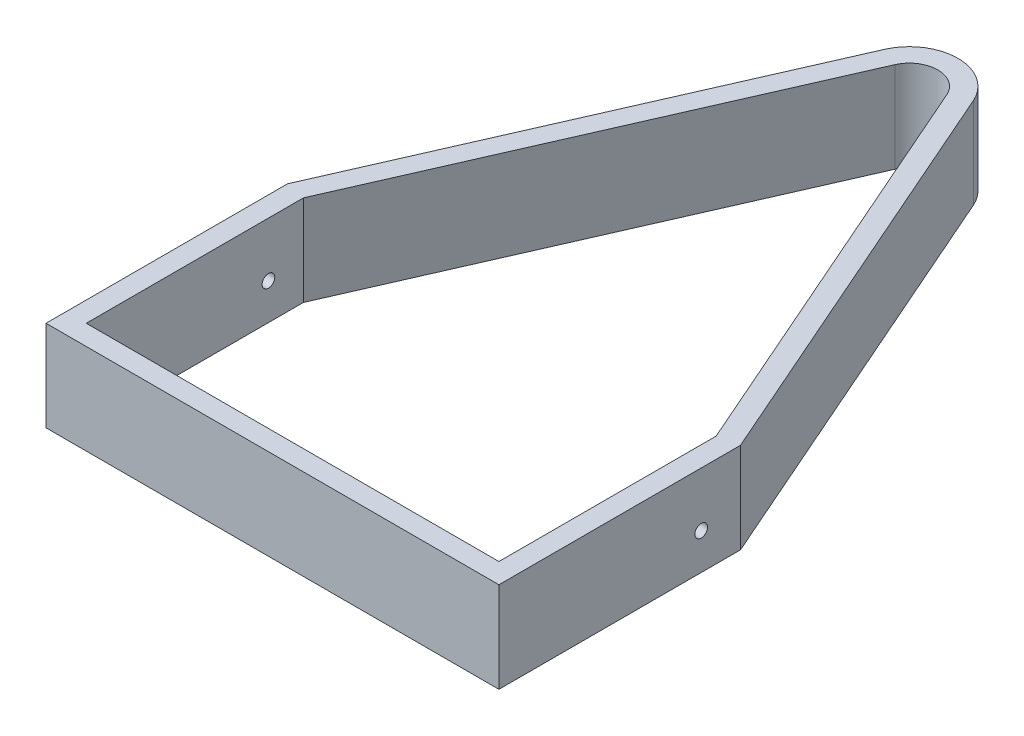
ISO-10303-21;
HEADER;
FILE_DESCRIPTION(('STEP AP214'),'2;1');
FILE_NAME('part.step','',(''),(''),'','','');
FILE_SCHEMA(('AUTOMOTIVE_DESIGN { 1 0 10303 214 1 1 1 1 }'));
ENDSEC;
DATA;
#1=APPLICATION_CONTEXT('core data for automotive mechanical design processes');
#2=APPLICATION_PROTOCOL_DEFINITION('international standard','automotive_design',2000,#1);
#3=PRODUCT_CONTEXT('',#1,'mechanical');
#4=PRODUCT('Part','Part','',(#3));
#5=PRODUCT_RELATED_PRODUCT_CATEGORY('part','',(#4));
#6=PRODUCT_DEFINITION_FORMATION('','',#4);
#7=PRODUCT_DEFINITION_CONTEXT('part definition',#1,'design');
#8=PRODUCT_DEFINITION('design','',#6,#7);
#9=PRODUCT_DEFINITION_SHAPE('','',#8);
#10=(LENGTH_UNIT() NAMED_UNIT(*) SI_UNIT(.MILLI.,.METRE.));
#11=(NAMED_UNIT(*) PLANE_ANGLE_UNIT() SI_UNIT($,.RADIAN.));
#12=(NAMED_UNIT(*) SI_UNIT($,.STERADIAN.) SOLID_ANGLE_UNIT());
#13=UNCERTAINTY_MEASURE_WITH_UNIT(LENGTH_MEASURE(1.E-05),#10,'distance_accuracy_value','');
#14=(GEOMETRIC_REPRESENTATION_CONTEXT(3) GLOBAL_UNCERTAINTY_ASSIGNED_CONTEXT((#13)) GLOBAL_UNIT_ASSIGNED_CONTEXT((#10,
#11,#12)) REPRESENTATION_CONTEXT('',''));
#15=CARTESIAN_POINT('',(0.,0.,0.));
#16=DIRECTION('',(0.,0.,1.));
#17=DIRECTION('',(1.,0.,0.));
#18=AXIS2_PLACEMENT_3D('',#15,#16,#17);
#19=CARTESIAN_POINT('',(0.,28.575,-200.91745481904));
#20=DIRECTION('',(0.,-1.,0.));
#21=DIRECTION('',(0.,0.,-1.));
#22=AXIS2_PLACEMENT_3D('',#19,#20,#21);
#23=PLANE('',#22);
#24=DIRECTION('',(0.,0.,-1.));
#25=VECTOR('',#24,1.);
#26=CARTESIAN_POINT('',(71.4375,28.575,0.));
#27=LINE('',#26,#25);
#28=CARTESIAN_POINT('',(71.4375,28.575,0.));
#29=VERTEX_POINT('',#28);
#30=CARTESIAN_POINT('',(71.4375,28.575,-76.2));
#31=VERTEX_POINT('',#30);
#32=EDGE_CURVE('E177',#29,#31,#27,.T.);
#33=ORIENTED_EDGE('',*,*,#32,.T.);
#34=DIRECTION('',(-0.401785714285714,0.,-0.915733716642517));
#35=VECTOR('',#34,1.);
#36=CARTESIAN_POINT('',(14.0180844391392,28.575,-207.068004882815));
#37=LINE('',#36,#35);
#38=CARTESIAN_POINT('',(14.0180844391392,28.575,-207.068004882815));
#39=VERTEX_POINT('',#38);
#40=EDGE_CURVE('E180',#31,#39,#37,.T.);
#41=ORIENTED_EDGE('',*,*,#40,.T.);
#42=CARTESIAN_POINT('',(0.,28.575,-200.91745481904));
#43=DIRECTION('',(0.,1.,0.));
#44=DIRECTION('',(0.,0.,-1.));
#45=AXIS2_PLACEMENT_3D('',#42,#43,#44);
#46=CIRCLE('',#45,15.3080357142857);
#47=CARTESIAN_POINT('',(-14.0180844391393,28.575,-207.068004882815));
#48=VERTEX_POINT('',#47);
#49=EDGE_CURVE('E183',#39,#48,#46,.T.);
#50=ORIENTED_EDGE('',*,*,#49,.T.);
#51=DIRECTION('',(-0.401785714285714,0.,0.915733716642518));
#52=VECTOR('',#51,1.);
#53=CARTESIAN_POINT('',(-71.4375,28.575,-76.2));
#54=LINE('',#53,#52);
#55=CARTESIAN_POINT('',(-71.4375,28.575,-76.2));
#56=VERTEX_POINT('',#55);
#57=EDGE_CURVE('E185',#48,#56,#54,.T.);
#58=ORIENTED_EDGE('',*,*,#57,.T.);
#59=DIRECTION('',(0.,0.,1.));
#60=VECTOR('',#59,1.);
#61=CARTESIAN_POINT('',(-71.4375,28.575,0.));
#62=LINE('',#61,#60);
#63=CARTESIAN_POINT('',(-71.4375,28.575,0.));
#64=VERTEX_POINT('',#63);
#65=EDGE_CURVE('E187',#56,#64,#62,.T.);
#66=ORIENTED_EDGE('',*,*,#65,.T.);
#67=DIRECTION('',(1.,0.,0.));
#68=VECTOR('',#67,1.);
#69=CARTESIAN_POINT('',(-71.4375,28.575,0.));
#70=LINE('',#69,#68);
#71=EDGE_CURVE('E189',#64,#29,#70,.T.);
#72=ORIENTED_EDGE('',*,*,#71,.T.);
#73=EDGE_LOOP('',(#33,#41,#50,#58,#66,#72));
#74=FACE_BOUND('',#73,.T.);
#75=DIRECTION('',(1.,0.,0.));
#76=VECTOR('',#75,1.);
#77=CARTESIAN_POINT('',(-65.0875,28.575,-6.35));
#78=LINE('',#77,#76);
#79=CARTESIAN_POINT('',(-65.0875,28.575,-6.35));
#80=VERTEX_POINT('',#79);
#81=CARTESIAN_POINT('',(65.0875,28.575,-6.35));
#82=VERTEX_POINT('',#81);
#83=EDGE_CURVE('E124',#80,#82,#78,.T.);
#84=ORIENTED_EDGE('',*,*,#83,.F.);
#85=DIRECTION('',(0.,0.,1.));
#86=VECTOR('',#85,1.);
#87=CARTESIAN_POINT('',(-65.0875,28.575,-6.35));
#88=LINE('',#87,#86);
#89=CARTESIAN_POINT('',(-65.0875,28.575,-74.8682182061368));
#90=VERTEX_POINT('',#89);
#91=EDGE_CURVE('E154',#90,#80,#88,.T.);
#92=ORIENTED_EDGE('',*,*,#91,.F.);
#93=DIRECTION('',(-0.401785714285714,0.,0.915733716642517));
#94=VECTOR('',#93,1.);
#95=CARTESIAN_POINT('',(-65.0875,28.575,-74.8682182061368));
#96=LINE('',#95,#94);
#97=CARTESIAN_POINT('',(-8.20317533845931,28.575,-204.516665597101));
#98=VERTEX_POINT('',#97);
#99=EDGE_CURVE('E152',#98,#90,#96,.T.);
#100=ORIENTED_EDGE('',*,*,#99,.F.);
#101=CARTESIAN_POINT('',(0.,28.575,-200.91745481904));
#102=DIRECTION('',(0.,1.,0.));
#103=DIRECTION('',(0.,0.,-1.));
#104=AXIS2_PLACEMENT_3D('',#101,#102,#103);
#105=CIRCLE('',#104,8.95803571428572);
#106=CARTESIAN_POINT('',(8.20317533845923,28.575,-204.516665597101));
#107=VERTEX_POINT('',#106);
#108=EDGE_CURVE('E147',#107,#98,#105,.T.);
#109=ORIENTED_EDGE('',*,*,#108,.F.);
#110=DIRECTION('',(-0.401785714285714,0.,-0.915733716642517));
#111=VECTOR('',#110,1.);
#112=CARTESIAN_POINT('',(8.20317533845923,28.575,-204.516665597101));
#113=LINE('',#112,#111);
#114=CARTESIAN_POINT('',(65.0875,28.575,-74.8682182061368));
#115=VERTEX_POINT('',#114);
#116=EDGE_CURVE('E145',#115,#107,#113,.T.);
#117=ORIENTED_EDGE('',*,*,#116,.F.);
#118=DIRECTION('',(0.,0.,-1.));
#119=VECTOR('',#118,1.);
#120=CARTESIAN_POINT('',(65.0875,28.575,-6.35));
#121=LINE('',#120,#119);
#122=EDGE_CURVE('E132',#82,#115,#121,.T.);
#123=ORIENTED_EDGE('',*,*,#122,.F.);
#124=EDGE_LOOP('',(#84,#92,#100,#109,#117,#123));
#125=FACE_BOUND('',#124,.T.);
#126=ADVANCED_FACE('F35',(#74,#125),#23,.F.);
#127=CARTESIAN_POINT('',(0.,0.,-200.91745481904));
#128=DIRECTION('',(0.,-1.,0.));
#129=DIRECTION('',(0.,0.,-1.));
#130=AXIS2_PLACEMENT_3D('',#127,#128,#129);
#131=PLANE('',#130);
#132=DIRECTION('',(0.,0.,-1.));
#133=VECTOR('',#132,1.);
#134=CARTESIAN_POINT('',(71.4375,0.,0.));
#135=LINE('',#134,#133);
#136=CARTESIAN_POINT('',(71.4375,0.,0.));
#137=VERTEX_POINT('',#136);
#138=CARTESIAN_POINT('',(71.4375,0.,-76.2));
#139=VERTEX_POINT('',#138);
#140=EDGE_CURVE('E140',#137,#139,#135,.T.);
#141=ORIENTED_EDGE('',*,*,#140,.F.);
#142=DIRECTION('',(1.,0.,0.));
#143=VECTOR('',#142,1.);
#144=CARTESIAN_POINT('',(-71.4375,0.,0.));
#145=LINE('',#144,#143);
#146=CARTESIAN_POINT('',(-71.4375,0.,0.));
#147=VERTEX_POINT('',#146);
#148=EDGE_CURVE('E181',#147,#137,#145,.T.);
#149=ORIENTED_EDGE('',*,*,#148,.F.);
#150=DIRECTION('',(0.,0.,1.));
#151=VECTOR('',#150,1.);
#152=CARTESIAN_POINT('',(-71.4375,0.,0.));
#153=LINE('',#152,#151);
#154=CARTESIAN_POINT('',(-71.4375,0.,-76.2));
#155=VERTEX_POINT('',#154);
#156=EDGE_CURVE('E200',#155,#147,#153,.T.);
#157=ORIENTED_EDGE('',*,*,#156,.F.);
#158=DIRECTION('',(-0.401785714285714,0.,0.915733716642518));
#159=VECTOR('',#158,1.);
#160=CARTESIAN_POINT('',(-71.4375,0.,-76.2));
#161=LINE('',#160,#159);
#162=CARTESIAN_POINT('',(-14.0180844391393,0.,-207.068004882815));
#163=VERTEX_POINT('',#162);
#164=EDGE_CURVE('E198',#163,#155,#161,.T.);
#165=ORIENTED_EDGE('',*,*,#164,.F.);
#166=CARTESIAN_POINT('',(0.,0.,-200.91745481904));
#167=DIRECTION('',(0.,1.,0.));
#168=DIRECTION('',(0.,0.,-1.));
#169=AXIS2_PLACEMENT_3D('',#166,#167,#168);
#170=CIRCLE('',#169,15.3080357142857);
#171=CARTESIAN_POINT('',(14.0180844391392,0.,-207.068004882815));
#172=VERTEX_POINT('',#171);
#173=EDGE_CURVE('E196',#172,#163,#170,.T.);
#174=ORIENTED_EDGE('',*,*,#173,.F.);
#175=DIRECTION('',(-0.401785714285714,0.,-0.915733716642517));
#176=VECTOR('',#175,1.);
#177=CARTESIAN_POINT('',(14.0180844391392,0.,-207.068004882815));
#178=LINE('',#177,#176);
#179=EDGE_CURVE('E194',#139,#172,#178,.T.);
#180=ORIENTED_EDGE('',*,*,#179,.F.);
#181=EDGE_LOOP('',(#141,#149,#157,#165,#174,#180));
#182=FACE_BOUND('',#181,.T.);
#183=DIRECTION('',(0.,0.,1.));
#184=VECTOR('',#183,1.);
#185=CARTESIAN_POINT('',(-65.0875,0.,-6.35));
#186=LINE('',#185,#184);
#187=CARTESIAN_POINT('',(-65.0875,0.,-74.8682182061368));
#188=VERTEX_POINT('',#187);
#189=CARTESIAN_POINT('',(-65.0875,0.,-6.34999999999999));
#190=VERTEX_POINT('',#189);
#191=EDGE_CURVE('E133',#188,#190,#186,.T.);
#192=ORIENTED_EDGE('',*,*,#191,.T.);
#193=DIRECTION('',(1.,0.,0.));
#194=VECTOR('',#193,1.);
#195=CARTESIAN_POINT('',(-65.0875,0.,-6.35));
#196=LINE('',#195,#194);
#197=CARTESIAN_POINT('',(65.0875,0.,-6.35));
#198=VERTEX_POINT('',#197);
#199=EDGE_CURVE('E58',#190,#198,#196,.T.);
#200=ORIENTED_EDGE('',*,*,#199,.T.);
#201=DIRECTION('',(0.,0.,-1.));
#202=VECTOR('',#201,1.);
#203=CARTESIAN_POINT('',(65.0875,0.,-6.35));
#204=LINE('',#203,#202);
#205=CARTESIAN_POINT('',(65.0875,0.,-74.8682182061368));
#206=VERTEX_POINT('',#205);
#207=EDGE_CURVE('E139',#198,#206,#204,.T.);
#208=ORIENTED_EDGE('',*,*,#207,.T.);
#209=DIRECTION('',(-0.401785714285714,0.,-0.915733716642517));
#210=VECTOR('',#209,1.);
#211=CARTESIAN_POINT('',(8.20317533845923,0.,-204.516665597101));
#212=LINE('',#211,#210);
#213=CARTESIAN_POINT('',(8.20317533845923,0.,-204.516665597101));
#214=VERTEX_POINT('',#213);
#215=EDGE_CURVE('E159',#206,#214,#212,.T.);
#216=ORIENTED_EDGE('',*,*,#215,.T.);
#217=CARTESIAN_POINT('',(0.,0.,-200.91745481904));
#218=DIRECTION('',(0.,1.,0.));
#219=DIRECTION('',(0.,0.,-1.));
#220=AXIS2_PLACEMENT_3D('',#217,#218,#219);
#221=CIRCLE('',#220,8.95803571428572);
#222=CARTESIAN_POINT('',(-8.20317533845931,0.,-204.516665597101));
#223=VERTEX_POINT('',#222);
#224=EDGE_CURVE('E162',#214,#223,#221,.T.);
#225=ORIENTED_EDGE('',*,*,#224,.T.);
#226=DIRECTION('',(-0.401785714285714,0.,0.915733716642517));
#227=VECTOR('',#226,1.);
#228=CARTESIAN_POINT('',(-65.0875,0.,-74.8682182061368));
#229=LINE('',#228,#227);
#230=EDGE_CURVE('E165',#223,#188,#229,.T.);
#231=ORIENTED_EDGE('',*,*,#230,.T.);
#232=EDGE_LOOP('',(#192,#200,#208,#216,#225,#231));
#233=FACE_BOUND('',#232,.T.);
#234=ADVANCED_FACE('F224',(#182,#233),#131,.T.);
#235=CARTESIAN_POINT('',(71.4375,28.575,0.));
#236=DIRECTION('',(-1.,0.,0.));
#237=DIRECTION('',(0.,0.,1.));
#238=AXIS2_PLACEMENT_3D('',#235,#236,#237);
#239=PLANE('',#238);
#240=CARTESIAN_POINT('',(71.4375,11.43,-63.8192182061368));
#241=DIRECTION('',(-1.,0.,0.));
#242=DIRECTION('',(0.,0.,1.));
#243=AXIS2_PLACEMENT_3D('',#240,#241,#242);
#244=CIRCLE('',#243,2.);
#245=CARTESIAN_POINT('',(71.4375,11.43,-61.8192182061368));
#246=VERTEX_POINT('',#245);
#247=EDGE_CURVE('E295',#246,#246,#244,.F.);
#248=ORIENTED_EDGE('',*,*,#247,.F.);
#249=EDGE_LOOP('',(#248));
#250=FACE_BOUND('',#249,.T.);
#251=ORIENTED_EDGE('',*,*,#140,.T.);
#252=DIRECTION('',(0.,-1.,0.));
#253=VECTOR('',#252,1.);
#254=CARTESIAN_POINT('',(71.4375,28.575,-76.2));
#255=LINE('',#254,#253);
#256=EDGE_CURVE('E11',#31,#139,#255,.T.);
#257=ORIENTED_EDGE('',*,*,#256,.F.);
#258=ORIENTED_EDGE('',*,*,#32,.F.);
#259=DIRECTION('',(0.,-1.,0.));
#260=VECTOR('',#259,1.);
#261=CARTESIAN_POINT('',(71.4375,28.575,0.));
#262=LINE('',#261,#260);
#263=EDGE_CURVE('E191',#29,#137,#262,.T.);
#264=ORIENTED_EDGE('',*,*,#263,.T.);
#265=EDGE_LOOP('',(#251,#257,#258,#264));
#266=FACE_BOUND('',#265,.T.);
#267=ADVANCED_FACE('F37',(#250,#266),#239,.F.);
#268=CARTESIAN_POINT('',(14.0180844391392,28.575,-207.068004882815));
#269=DIRECTION('',(-0.915733716642517,0.,0.401785714285714));
#270=DIRECTION('',(0.401785714285714,0.,0.915733716642517));
#271=AXIS2_PLACEMENT_3D('',#268,#269,#270);
#272=PLANE('',#271);
#273=ORIENTED_EDGE('',*,*,#179,.T.);
#274=DIRECTION('',(0.,-1.,0.));
#275=VECTOR('',#274,1.);
#276=CARTESIAN_POINT('',(14.0180844391392,28.575,-207.068004882815));
#277=LINE('',#276,#275);
#278=EDGE_CURVE('E43',#39,#172,#277,.T.);
#279=ORIENTED_EDGE('',*,*,#278,.F.);
#280=ORIENTED_EDGE('',*,*,#40,.F.);
#281=ORIENTED_EDGE('',*,*,#256,.T.);
#282=EDGE_LOOP('',(#273,#279,#280,#281));
#283=FACE_BOUND('',#282,.T.);
#284=ADVANCED_FACE('F241',(#283),#272,.F.);
#285=CARTESIAN_POINT('',(0.,28.575,-200.91745481904));
#286=DIRECTION('',(0.,-1.,0.));
#287=DIRECTION('',(0.,0.,-1.));
#288=AXIS2_PLACEMENT_3D('',#285,#286,#287);
#289=CYLINDRICAL_SURFACE('',#288,15.3080357142857);
#290=ORIENTED_EDGE('',*,*,#173,.T.);
#291=DIRECTION('',(0.,-1.,0.));
#292=VECTOR('',#291,1.);
#293=CARTESIAN_POINT('',(-14.0180844391393,28.575,-207.068004882815));
#294=LINE('',#293,#292);
#295=EDGE_CURVE('E211',#48,#163,#294,.T.);
#296=ORIENTED_EDGE('',*,*,#295,.F.);
#297=ORIENTED_EDGE('',*,*,#49,.F.);
#298=ORIENTED_EDGE('',*,*,#278,.T.);
#299=EDGE_LOOP('',(#290,#296,#297,#298));
#300=FACE_BOUND('',#299,.T.);
#301=ADVANCED_FACE('F218',(#300),#289,.T.);
#302=CARTESIAN_POINT('',(-71.4375,28.575,-76.2));
#303=DIRECTION('',(0.915733716642517,0.,0.401785714285714));
#304=DIRECTION('',(0.401785714285714,0.,-0.915733716642518));
#305=AXIS2_PLACEMENT_3D('',#302,#303,#304);
#306=PLANE('',#305);
#307=ORIENTED_EDGE('',*,*,#164,.T.);
#308=DIRECTION('',(0.,-1.,0.));
#309=VECTOR('',#308,1.);
#310=CARTESIAN_POINT('',(-71.4375,28.575,-76.2));
#311=LINE('',#310,#309);
#312=EDGE_CURVE('E208',#56,#155,#311,.T.);
#313=ORIENTED_EDGE('',*,*,#312,.F.);
#314=ORIENTED_EDGE('',*,*,#57,.F.);
#315=ORIENTED_EDGE('',*,*,#295,.T.);
#316=EDGE_LOOP('',(#307,#313,#314,#315));
#317=FACE_BOUND('',#316,.T.);
#318=ADVANCED_FACE('F230',(#317),#306,.F.);
#319=CARTESIAN_POINT('',(-71.4375,28.575,0.));
#320=DIRECTION('',(1.,0.,0.));
#321=DIRECTION('',(0.,0.,-1.));
#322=AXIS2_PLACEMENT_3D('',#319,#320,#321);
#323=PLANE('',#322);
#324=CARTESIAN_POINT('',(-71.4375,11.43,-63.8192182061368));
#325=DIRECTION('',(1.,0.,0.));
#326=DIRECTION('',(0.,0.,-1.));
#327=AXIS2_PLACEMENT_3D('',#324,#325,#326);
#328=CIRCLE('',#327,2.);
#329=CARTESIAN_POINT('',(-71.4375,11.43,-65.8192182061368));
#330=VERTEX_POINT('',#329);
#331=EDGE_CURVE('E157',#330,#330,#328,.F.);
#332=ORIENTED_EDGE('',*,*,#331,.F.);
#333=EDGE_LOOP('',(#332));
#334=FACE_BOUND('',#333,.T.);
#335=ORIENTED_EDGE('',*,*,#156,.T.);
#336=DIRECTION('',(0.,-1.,0.));
#337=VECTOR('',#336,1.);
#338=CARTESIAN_POINT('',(-71.4375,28.575,0.));
#339=LINE('',#338,#337);
#340=EDGE_CURVE('E205',#64,#147,#339,.T.);
#341=ORIENTED_EDGE('',*,*,#340,.F.);
#342=ORIENTED_EDGE('',*,*,#65,.F.);
#343=ORIENTED_EDGE('',*,*,#312,.T.);
#344=EDGE_LOOP('',(#335,#341,#342,#343));
#345=FACE_BOUND('',#344,.T.);
#346=ADVANCED_FACE('F234',(#334,#345),#323,.F.);
#347=CARTESIAN_POINT('',(-71.4375,28.575,0.));
#348=DIRECTION('',(0.,0.,-1.));
#349=DIRECTION('',(-1.,0.,0.));
#350=AXIS2_PLACEMENT_3D('',#347,#348,#349);
#351=PLANE('',#350);
#352=ORIENTED_EDGE('',*,*,#148,.T.);
#353=ORIENTED_EDGE('',*,*,#263,.F.);
#354=ORIENTED_EDGE('',*,*,#71,.F.);
#355=ORIENTED_EDGE('',*,*,#340,.T.);
#356=EDGE_LOOP('',(#352,#353,#354,#355));
#357=FACE_BOUND('',#356,.T.);
#358=ADVANCED_FACE('F244',(#357),#351,.F.);
#359=CARTESIAN_POINT('',(-65.0875,28.575,-6.35));
#360=DIRECTION('',(0.,0.,-1.));
#361=DIRECTION('',(-1.,0.,0.));
#362=AXIS2_PLACEMENT_3D('',#359,#360,#361);
#363=PLANE('',#362);
#364=ORIENTED_EDGE('',*,*,#199,.F.);
#365=DIRECTION('',(0.,-1.,0.));
#366=VECTOR('',#365,1.);
#367=CARTESIAN_POINT('',(-65.0875,28.575,-6.35));
#368=LINE('',#367,#366);
#369=EDGE_CURVE('E128',#80,#190,#368,.T.);
#370=ORIENTED_EDGE('',*,*,#369,.F.);
#371=ORIENTED_EDGE('',*,*,#83,.T.);
#372=DIRECTION('',(0.,-1.,0.));
#373=VECTOR('',#372,1.);
#374=CARTESIAN_POINT('',(65.0875,28.575,-6.35));
#375=LINE('',#374,#373);
#376=EDGE_CURVE('E127',#82,#198,#375,.T.);
#377=ORIENTED_EDGE('',*,*,#376,.T.);
#378=EDGE_LOOP('',(#364,#370,#371,#377));
#379=FACE_BOUND('',#378,.T.);
#380=ADVANCED_FACE('F126',(#379),#363,.T.);
#381=CARTESIAN_POINT('',(65.0875,28.575,-6.35));
#382=DIRECTION('',(-1.,0.,0.));
#383=DIRECTION('',(0.,0.,1.));
#384=AXIS2_PLACEMENT_3D('',#381,#382,#383);
#385=PLANE('',#384);
#386=CARTESIAN_POINT('',(65.0875,11.43,-63.8192182061368));
#387=DIRECTION('',(-1.,0.,0.));
#388=DIRECTION('',(0.,0.,1.));
#389=AXIS2_PLACEMENT_3D('',#386,#387,#388);
#390=CIRCLE('',#389,2.);
#391=CARTESIAN_POINT('',(65.0875,11.43,-61.8192182061368));
#392=VERTEX_POINT('',#391);
#393=EDGE_CURVE('E292',#392,#392,#390,.T.);
#394=ORIENTED_EDGE('',*,*,#393,.F.);
#395=EDGE_LOOP('',(#394));
#396=FACE_BOUND('',#395,.T.);
#397=ORIENTED_EDGE('',*,*,#207,.F.);
#398=ORIENTED_EDGE('',*,*,#376,.F.);
#399=ORIENTED_EDGE('',*,*,#122,.T.);
#400=DIRECTION('',(0.,-1.,0.));
#401=VECTOR('',#400,1.);
#402=CARTESIAN_POINT('',(65.0875,28.575,-74.8682182061368));
#403=LINE('',#402,#401);
#404=EDGE_CURVE('E141',#115,#206,#403,.T.);
#405=ORIENTED_EDGE('',*,*,#404,.T.);
#406=EDGE_LOOP('',(#397,#398,#399,#405));
#407=FACE_BOUND('',#406,.T.);
#408=ADVANCED_FACE('F136',(#396,#407),#385,.T.);
#409=CARTESIAN_POINT('',(8.20317533845923,28.575,-204.516665597101));
#410=DIRECTION('',(-0.915733716642517,0.,0.401785714285714));
#411=DIRECTION('',(0.401785714285714,0.,0.915733716642517));
#412=AXIS2_PLACEMENT_3D('',#409,#410,#411);
#413=PLANE('',#412);
#414=ORIENTED_EDGE('',*,*,#215,.F.);
#415=ORIENTED_EDGE('',*,*,#404,.F.);
#416=ORIENTED_EDGE('',*,*,#116,.T.);
#417=DIRECTION('',(0.,-1.,0.));
#418=VECTOR('',#417,1.);
#419=CARTESIAN_POINT('',(8.20317533845923,28.575,-204.516665597101));
#420=LINE('',#419,#418);
#421=EDGE_CURVE('E174',#107,#214,#420,.T.);
#422=ORIENTED_EDGE('',*,*,#421,.T.);
#423=EDGE_LOOP('',(#414,#415,#416,#422));
#424=FACE_BOUND('',#423,.T.);
#425=ADVANCED_FACE('F263',(#424),#413,.T.);
#426=CARTESIAN_POINT('',(0.,28.575,-200.91745481904));
#427=DIRECTION('',(0.,-1.,0.));
#428=DIRECTION('',(0.,0.,-1.));
#429=AXIS2_PLACEMENT_3D('',#426,#427,#428);
#430=CYLINDRICAL_SURFACE('',#429,8.95803571428572);
#431=ORIENTED_EDGE('',*,*,#224,.F.);
#432=ORIENTED_EDGE('',*,*,#421,.F.);
#433=ORIENTED_EDGE('',*,*,#108,.T.);
#434=DIRECTION('',(0.,-1.,0.));
#435=VECTOR('',#434,1.);
#436=CARTESIAN_POINT('',(-8.20317533845931,28.575,-204.516665597101));
#437=LINE('',#436,#435);
#438=EDGE_CURVE('E172',#98,#223,#437,.T.);
#439=ORIENTED_EDGE('',*,*,#438,.T.);
#440=EDGE_LOOP('',(#431,#432,#433,#439));
#441=FACE_BOUND('',#440,.T.);
#442=ADVANCED_FACE('F267',(#441),#430,.F.);
#443=CARTESIAN_POINT('',(-65.0875,28.575,-74.8682182061368));
#444=DIRECTION('',(0.915733716642518,0.,0.401785714285714));
#445=DIRECTION('',(0.401785714285714,0.,-0.915733716642517));
#446=AXIS2_PLACEMENT_3D('',#443,#444,#445);
#447=PLANE('',#446);
#448=ORIENTED_EDGE('',*,*,#230,.F.);
#449=ORIENTED_EDGE('',*,*,#438,.F.);
#450=ORIENTED_EDGE('',*,*,#99,.T.);
#451=DIRECTION('',(0.,-1.,0.));
#452=VECTOR('',#451,1.);
#453=CARTESIAN_POINT('',(-65.0875,28.575,-74.8682182061368));
#454=LINE('',#453,#452);
#455=EDGE_CURVE('E50',#90,#188,#454,.T.);
#456=ORIENTED_EDGE('',*,*,#455,.T.);
#457=EDGE_LOOP('',(#448,#449,#450,#456));
#458=FACE_BOUND('',#457,.T.);
#459=ADVANCED_FACE('F271',(#458),#447,.T.);
#460=CARTESIAN_POINT('',(-65.0875,28.575,-6.35));
#461=DIRECTION('',(1.,0.,0.));
#462=DIRECTION('',(0.,0.,-1.));
#463=AXIS2_PLACEMENT_3D('',#460,#461,#462);
#464=PLANE('',#463);
#465=CARTESIAN_POINT('',(-65.0875,11.43,-63.8192182061368));
#466=DIRECTION('',(1.,0.,0.));
#467=DIRECTION('',(0.,0.,-1.));
#468=AXIS2_PLACEMENT_3D('',#465,#466,#467);
#469=CIRCLE('',#468,2.);
#470=CARTESIAN_POINT('',(-65.0875,11.43,-65.8192182061368));
#471=VERTEX_POINT('',#470);
#472=EDGE_CURVE('E297',#471,#471,#469,.T.);
#473=ORIENTED_EDGE('',*,*,#472,.F.);
#474=EDGE_LOOP('',(#473));
#475=FACE_BOUND('',#474,.T.);
#476=ORIENTED_EDGE('',*,*,#191,.F.);
#477=ORIENTED_EDGE('',*,*,#455,.F.);
#478=ORIENTED_EDGE('',*,*,#91,.T.);
#479=ORIENTED_EDGE('',*,*,#369,.T.);
#480=EDGE_LOOP('',(#476,#477,#478,#479));
#481=FACE_BOUND('',#480,.T.);
#482=ADVANCED_FACE('F275',(#475,#481),#464,.T.);
#483=CARTESIAN_POINT('',(-71.4385,11.43,-63.8192182061368));
#484=DIRECTION('',(1.,0.,0.));
#485=DIRECTION('',(0.,0.,-1.));
#486=AXIS2_PLACEMENT_3D('',#483,#484,#485);
#487=CYLINDRICAL_SURFACE('',#486,2.);
#488=CARTESIAN_POINT('',(-65.0875,11.43,-65.8192182061368));
#489=CARTESIAN_POINT('',(-65.1536458333333,11.43,-65.8192182061368));
#490=CARTESIAN_POINT('',(-65.2197916666667,11.43,-65.8192182061368));
#491=CARTESIAN_POINT('',(-65.3520833333334,11.43,-65.8192182061368));
#492=CARTESIAN_POINT('',(-65.4182291666667,11.43,-65.8192182061368));
#493=CARTESIAN_POINT('',(-65.5505208333334,11.43,-65.8192182061368));
#494=CARTESIAN_POINT('',(-65.6166666666667,11.43,-65.8192182061368));
#495=CARTESIAN_POINT('',(-65.7489583333333,11.43,-65.8192182061368));
#496=CARTESIAN_POINT('',(-65.8151041666667,11.43,-65.8192182061368));
#497=CARTESIAN_POINT('',(-65.9473958333333,11.43,-65.8192182061368));
#498=CARTESIAN_POINT('',(-66.0135416666667,11.43,-65.8192182061368));
#499=CARTESIAN_POINT('',(-66.1458333333333,11.43,-65.8192182061368));
#500=CARTESIAN_POINT('',(-66.2119791666667,11.43,-65.8192182061368));
#501=CARTESIAN_POINT('',(-66.3442708333333,11.43,-65.8192182061368));
#502=CARTESIAN_POINT('',(-66.4104166666667,11.43,-65.8192182061368));
#503=CARTESIAN_POINT('',(-66.5427083333334,11.43,-65.8192182061368));
#504=CARTESIAN_POINT('',(-66.6088541666667,11.43,-65.8192182061368));
#505=CARTESIAN_POINT('',(-66.7411458333333,11.43,-65.8192182061368));
#506=CARTESIAN_POINT('',(-66.8072916666667,11.43,-65.8192182061368));
#507=CARTESIAN_POINT('',(-66.9395833333333,11.43,-65.8192182061368));
#508=CARTESIAN_POINT('',(-67.0057291666667,11.43,-65.8192182061368));
#509=CARTESIAN_POINT('',(-67.1380208333334,11.43,-65.8192182061368));
#510=CARTESIAN_POINT('',(-67.2041666666667,11.43,-65.8192182061368));
#511=CARTESIAN_POINT('',(-67.3364583333334,11.43,-65.8192182061368));
#512=CARTESIAN_POINT('',(-67.4026041666667,11.43,-65.8192182061368));
#513=CARTESIAN_POINT('',(-67.5348958333334,11.43,-65.8192182061368));
#514=CARTESIAN_POINT('',(-67.6010416666667,11.43,-65.8192182061368));
#515=CARTESIAN_POINT('',(-67.7333333333333,11.43,-65.8192182061368));
#516=CARTESIAN_POINT('',(-67.7994791666667,11.43,-65.8192182061368));
#517=CARTESIAN_POINT('',(-67.9317708333333,11.43,-65.8192182061368));
#518=CARTESIAN_POINT('',(-67.9979166666667,11.43,-65.8192182061368));
#519=CARTESIAN_POINT('',(-68.1302083333333,11.43,-65.8192182061368));
#520=CARTESIAN_POINT('',(-68.1963541666667,11.43,-65.8192182061368));
#521=CARTESIAN_POINT('',(-68.3286458333333,11.43,-65.8192182061368));
#522=CARTESIAN_POINT('',(-68.3947916666667,11.43,-65.8192182061368));
#523=CARTESIAN_POINT('',(-68.5270833333334,11.43,-65.8192182061368));
#524=CARTESIAN_POINT('',(-68.5932291666667,11.43,-65.8192182061368));
#525=CARTESIAN_POINT('',(-68.7255208333333,11.43,-65.8192182061368));
#526=CARTESIAN_POINT('',(-68.7916666666667,11.43,-65.8192182061368));
#527=CARTESIAN_POINT('',(-68.9239583333333,11.43,-65.8192182061368));
#528=CARTESIAN_POINT('',(-68.9901041666667,11.43,-65.8192182061368));
#529=CARTESIAN_POINT('',(-69.1223958333333,11.43,-65.8192182061368));
#530=CARTESIAN_POINT('',(-69.1885416666667,11.43,-65.8192182061368));
#531=CARTESIAN_POINT('',(-69.3208333333333,11.43,-65.8192182061368));
#532=CARTESIAN_POINT('',(-69.3869791666667,11.43,-65.8192182061368));
#533=CARTESIAN_POINT('',(-69.5192708333333,11.43,-65.8192182061368));
#534=CARTESIAN_POINT('',(-69.5854166666667,11.43,-65.8192182061368));
#535=CARTESIAN_POINT('',(-69.7177083333333,11.43,-65.8192182061368));
#536=CARTESIAN_POINT('',(-69.7838541666667,11.43,-65.8192182061368));
#537=CARTESIAN_POINT('',(-69.9161458333333,11.43,-65.8192182061368));
#538=CARTESIAN_POINT('',(-69.9822916666667,11.43,-65.8192182061368));
#539=CARTESIAN_POINT('',(-70.1145833333333,11.43,-65.8192182061368));
#540=CARTESIAN_POINT('',(-70.1807291666667,11.43,-65.8192182061368));
#541=CARTESIAN_POINT('',(-70.3130208333334,11.43,-65.8192182061368));
#542=CARTESIAN_POINT('',(-70.3791666666667,11.43,-65.8192182061368));
#543=CARTESIAN_POINT('',(-70.5114583333334,11.43,-65.8192182061368));
#544=CARTESIAN_POINT('',(-70.5776041666667,11.43,-65.8192182061368));
#545=CARTESIAN_POINT('',(-70.7098958333333,11.43,-65.8192182061368));
#546=CARTESIAN_POINT('',(-70.7760416666667,11.43,-65.8192182061368));
#547=CARTESIAN_POINT('',(-70.9083333333333,11.43,-65.8192182061368));
#548=CARTESIAN_POINT('',(-70.9744791666667,11.43,-65.8192182061368));
#549=CARTESIAN_POINT('',(-71.1067708333333,11.43,-65.8192182061368));
#550=CARTESIAN_POINT('',(-71.1729166666667,11.43,-65.8192182061368));
#551=CARTESIAN_POINT('',(-71.3052083333333,11.43,-65.8192182061368));
#552=CARTESIAN_POINT('',(-71.3713541666667,11.43,-65.8192182061368));
#553=CARTESIAN_POINT('',(-71.4375,11.43,-65.8192182061368));
#554=B_SPLINE_CURVE_WITH_KNOTS('',3,(#488,#489,#490,#491,#492,#493,#494,#495,#496,#497,#498,
#499,#500,#501,#502,#503,#504,#505,#506,#507,#508,#509,#510,#511,#512,#513,#514,#515,#516,#517,
#518,#519,#520,#521,#522,#523,#524,#525,#526,#527,#528,#529,#530,#531,#532,#533,#534,#535,#536,
#537,#538,#539,#540,#541,#542,#543,#544,#545,#546,#547,#548,#549,#550,#551,#552,#553),
.UNSPECIFIED.,.F.,.F.,(4,2,2,2,2,2,2,2,2,2,2,2,2,2,2,2,2,2,2,2,2,2,2,2,2,2,2,2,2,2,2,2,4),(0.,
0.198437500000009,0.396875000000005,0.5953125,0.79375000000001,0.992187500000005,1.190625,
1.38906250000001,1.58750000000001,1.7859375,1.98437500000001,2.18281250000001,2.38125,
2.57968750000001,2.77812500000001,2.9765625,3.175,3.37343750000001,3.571875,3.7703125,
3.96875000000001,4.1671875,4.365625,4.56406250000001,4.7625,4.9609375,5.15937500000001,
5.3578125,5.55625,5.75468750000001,5.953125,6.1515625,6.35000000000001),.UNSPECIFIED.);
#555=EDGE_CURVE('BSEAM279',#471,#330,#554,.T.);
#556=ORIENTED_EDGE('',*,*,#472,.T.);
#557=ORIENTED_EDGE('',*,*,#331,.T.);
#558=ORIENTED_EDGE('',*,*,#555,.T.);
#559=ORIENTED_EDGE('',*,*,#555,.F.);
#560=EDGE_LOOP('',(#556,#558,#557,#559));
#561=FACE_BOUND('',#560,.T.);
#562=ADVANCED_FACE('F279',(#561),#487,.F.);
#563=CARTESIAN_POINT('',(71.4385,11.43,-63.8192182061368));
#564=DIRECTION('',(-1.,0.,0.));
#565=DIRECTION('',(0.,0.,1.));
#566=AXIS2_PLACEMENT_3D('',#563,#564,#565);
#567=CYLINDRICAL_SURFACE('',#566,2.);
#568=CARTESIAN_POINT('',(65.0875,11.43,-61.8192182061368));
#569=CARTESIAN_POINT('',(65.1536458333333,11.43,-61.8192182061368));
#570=CARTESIAN_POINT('',(65.2197916666667,11.43,-61.8192182061368));
#571=CARTESIAN_POINT('',(65.3520833333333,11.43,-61.8192182061368));
#572=CARTESIAN_POINT('',(65.4182291666667,11.43,-61.8192182061368));
#573=CARTESIAN_POINT('',(65.5505208333333,11.43,-61.8192182061368));
#574=CARTESIAN_POINT('',(65.6166666666667,11.43,-61.8192182061368));
#575=CARTESIAN_POINT('',(65.7489583333333,11.43,-61.8192182061368));
#576=CARTESIAN_POINT('',(65.8151041666667,11.43,-61.8192182061368));
#577=CARTESIAN_POINT('',(65.9473958333333,11.43,-61.8192182061368));
#578=CARTESIAN_POINT('',(66.0135416666667,11.43,-61.8192182061368));
#579=CARTESIAN_POINT('',(66.1458333333333,11.43,-61.8192182061368));
#580=CARTESIAN_POINT('',(66.2119791666667,11.43,-61.8192182061368));
#581=CARTESIAN_POINT('',(66.3442708333333,11.43,-61.8192182061368));
#582=CARTESIAN_POINT('',(66.4104166666667,11.43,-61.8192182061368));
#583=CARTESIAN_POINT('',(66.5427083333333,11.43,-61.8192182061368));
#584=CARTESIAN_POINT('',(66.6088541666667,11.43,-61.8192182061368));
#585=CARTESIAN_POINT('',(66.7411458333333,11.43,-61.8192182061368));
#586=CARTESIAN_POINT('',(66.8072916666667,11.43,-61.8192182061368));
#587=CARTESIAN_POINT('',(66.9395833333333,11.43,-61.8192182061368));
#588=CARTESIAN_POINT('',(67.0057291666667,11.43,-61.8192182061368));
#589=CARTESIAN_POINT('',(67.1380208333333,11.43,-61.8192182061368));
#590=CARTESIAN_POINT('',(67.2041666666667,11.43,-61.8192182061368));
#591=CARTESIAN_POINT('',(67.3364583333333,11.43,-61.8192182061368));
#592=CARTESIAN_POINT('',(67.4026041666667,11.43,-61.8192182061368));
#593=CARTESIAN_POINT('',(67.5348958333333,11.43,-61.8192182061368));
#594=CARTESIAN_POINT('',(67.6010416666667,11.43,-61.8192182061368));
#595=CARTESIAN_POINT('',(67.7333333333333,11.43,-61.8192182061368));
#596=CARTESIAN_POINT('',(67.7994791666666,11.43,-61.8192182061368));
#597=CARTESIAN_POINT('',(67.9317708333333,11.43,-61.8192182061368));
#598=CARTESIAN_POINT('',(67.9979166666667,11.43,-61.8192182061368));
#599=CARTESIAN_POINT('',(68.1302083333333,11.43,-61.8192182061368));
#600=CARTESIAN_POINT('',(68.1963541666667,11.43,-61.8192182061368));
#601=CARTESIAN_POINT('',(68.3286458333333,11.43,-61.8192182061368));
#602=CARTESIAN_POINT('',(68.3947916666666,11.43,-61.8192182061368));
#603=CARTESIAN_POINT('',(68.5270833333333,11.43,-61.8192182061368));
#604=CARTESIAN_POINT('',(68.5932291666667,11.43,-61.8192182061368));
#605=CARTESIAN_POINT('',(68.7255208333333,11.43,-61.8192182061368));
#606=CARTESIAN_POINT('',(68.7916666666667,11.43,-61.8192182061368));
#607=CARTESIAN_POINT('',(68.9239583333333,11.43,-61.8192182061368));
#608=CARTESIAN_POINT('',(68.9901041666667,11.43,-61.8192182061368));
#609=CARTESIAN_POINT('',(69.1223958333333,11.43,-61.8192182061368));
#610=CARTESIAN_POINT('',(69.1885416666667,11.43,-61.8192182061368));
#611=CARTESIAN_POINT('',(69.3208333333333,11.43,-61.8192182061368));
#612=CARTESIAN_POINT('',(69.3869791666666,11.43,-61.8192182061368));
#613=CARTESIAN_POINT('',(69.5192708333333,11.43,-61.8192182061368));
#614=CARTESIAN_POINT('',(69.5854166666666,11.43,-61.8192182061368));
#615=CARTESIAN_POINT('',(69.7177083333333,11.43,-61.8192182061368));
#616=CARTESIAN_POINT('',(69.7838541666666,11.43,-61.8192182061368));
#617=CARTESIAN_POINT('',(69.9161458333333,11.43,-61.8192182061368));
#618=CARTESIAN_POINT('',(69.9822916666667,11.43,-61.8192182061368));
#619=CARTESIAN_POINT('',(70.1145833333333,11.43,-61.8192182061368));
#620=CARTESIAN_POINT('',(70.1807291666667,11.43,-61.8192182061368));
#621=CARTESIAN_POINT('',(70.3130208333333,11.43,-61.8192182061368));
#622=CARTESIAN_POINT('',(70.3791666666666,11.43,-61.8192182061368));
#623=CARTESIAN_POINT('',(70.5114583333333,11.43,-61.8192182061368));
#624=CARTESIAN_POINT('',(70.5776041666666,11.43,-61.8192182061368));
#625=CARTESIAN_POINT('',(70.7098958333333,11.43,-61.8192182061368));
#626=CARTESIAN_POINT('',(70.7760416666667,11.43,-61.8192182061368));
#627=CARTESIAN_POINT('',(70.9083333333333,11.43,-61.8192182061368));
#628=CARTESIAN_POINT('',(70.9744791666666,11.43,-61.8192182061368));
#629=CARTESIAN_POINT('',(71.1067708333333,11.43,-61.8192182061368));
#630=CARTESIAN_POINT('',(71.1729166666666,11.43,-61.8192182061368));
#631=CARTESIAN_POINT('',(71.3052083333333,11.43,-61.8192182061368));
#632=CARTESIAN_POINT('',(71.3713541666666,11.43,-61.8192182061368));
#633=CARTESIAN_POINT('',(71.4375,11.43,-61.8192182061368));
#634=B_SPLINE_CURVE_WITH_KNOTS('',3,(#568,#569,#570,#571,#572,#573,#574,#575,#576,#577,#578,
#579,#580,#581,#582,#583,#584,#585,#586,#587,#588,#589,#590,#591,#592,#593,#594,#595,#596,#597,
#598,#599,#600,#601,#602,#603,#604,#605,#606,#607,#608,#609,#610,#611,#612,#613,#614,#615,#616,
#617,#618,#619,#620,#621,#622,#623,#624,#625,#626,#627,#628,#629,#630,#631,#632,#633),
.UNSPECIFIED.,.F.,.F.,(4,2,2,2,2,2,2,2,2,2,2,2,2,2,2,2,2,2,2,2,2,2,2,2,2,2,2,2,2,2,2,2,4),(0.,
0.198437499999995,0.396874999999991,0.595312499999986,0.793749999999996,0.992187499999991,
1.19062499999999,1.3890625,1.58749999999999,1.78593749999999,1.98437499999998,2.18281249999999,
2.38124999999999,2.57968749999998,2.77812499999998,2.97656249999999,3.17499999999998,
3.37343749999998,3.57187499999999,3.77031249999998,3.96874999999998,4.16718749999997,
4.36562499999998,4.56406249999998,4.76249999999998,4.96093749999998,5.15937499999998,
5.35781249999998,5.55624999999997,5.75468749999998,5.95312499999998,6.15156249999997,
6.34999999999998),.UNSPECIFIED.);
#635=EDGE_CURVE('BSEAM283',#392,#246,#634,.T.);
#636=ORIENTED_EDGE('',*,*,#393,.T.);
#637=ORIENTED_EDGE('',*,*,#247,.T.);
#638=ORIENTED_EDGE('',*,*,#635,.T.);
#639=ORIENTED_EDGE('',*,*,#635,.F.);
#640=EDGE_LOOP('',(#636,#638,#637,#639));
#641=FACE_BOUND('',#640,.T.);
#642=ADVANCED_FACE('F283',(#641),#567,.F.);
#643=CLOSED_SHELL('',(#126,#234,#267,#284,#301,#318,#346,#358,#380,#408,#425,#442,#459,#482,
#562,#642));
#644=MANIFOLD_SOLID_BREP('B2',#643);
#645=ADVANCED_BREP_SHAPE_REPRESENTATION('',(#18,#644),#14);
#646=SHAPE_DEFINITION_REPRESENTATION(#9,#645);
ENDSEC;
END-ISO-10303-21;
